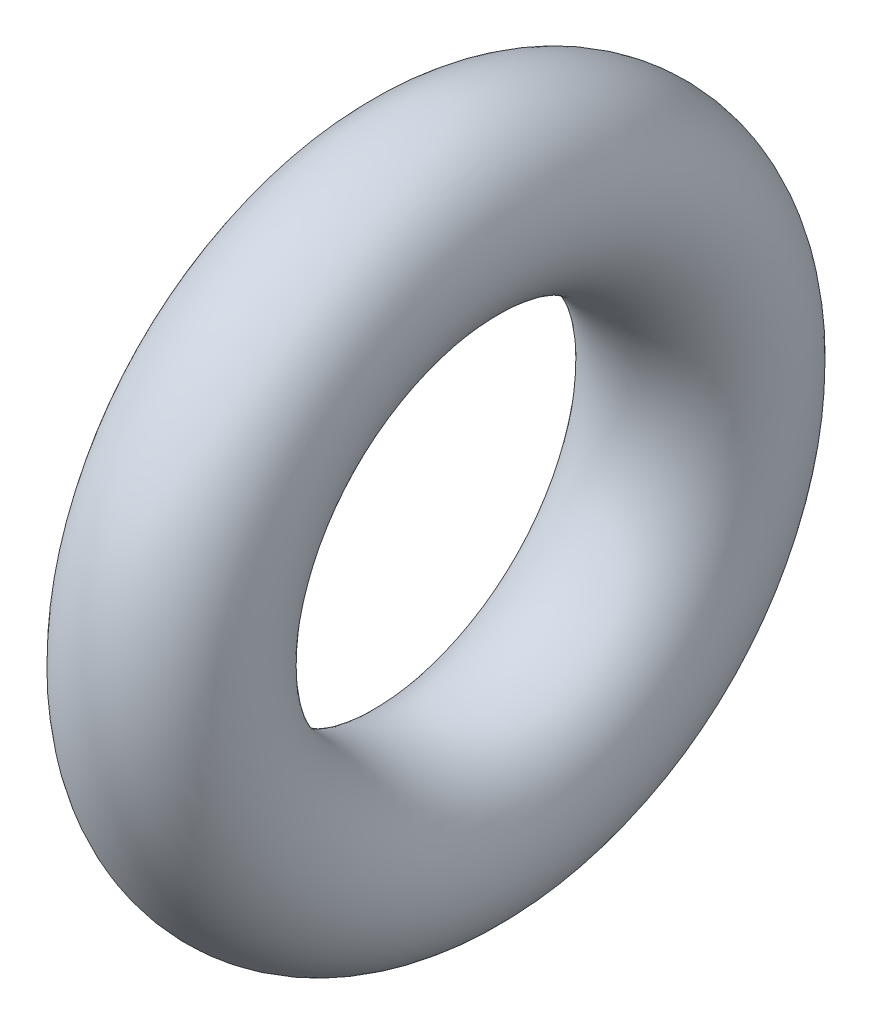
ISO-10303-21;
HEADER;
FILE_DESCRIPTION(('STEP AP214'),'2;1');
FILE_NAME('part.step','',(''),(''),'','','');
FILE_SCHEMA(('AUTOMOTIVE_DESIGN { 1 0 10303 214 1 1 1 1 }'));
ENDSEC;
DATA;
#1=APPLICATION_CONTEXT('core data for automotive mechanical design processes');
#2=APPLICATION_PROTOCOL_DEFINITION('international standard','automotive_design',2000,#1);
#3=PRODUCT_CONTEXT('',#1,'mechanical');
#4=PRODUCT('Part','Part','',(#3));
#5=PRODUCT_RELATED_PRODUCT_CATEGORY('part','',(#4));
#6=PRODUCT_DEFINITION_FORMATION('','',#4);
#7=PRODUCT_DEFINITION_CONTEXT('part definition',#1,'design');
#8=PRODUCT_DEFINITION('design','',#6,#7);
#9=PRODUCT_DEFINITION_SHAPE('','',#8);
#10=(LENGTH_UNIT() NAMED_UNIT(*) SI_UNIT(.MILLI.,.METRE.));
#11=(NAMED_UNIT(*) PLANE_ANGLE_UNIT() SI_UNIT($,.RADIAN.));
#12=(NAMED_UNIT(*) SI_UNIT($,.STERADIAN.) SOLID_ANGLE_UNIT());
#13=UNCERTAINTY_MEASURE_WITH_UNIT(LENGTH_MEASURE(1.E-05),#10,'distance_accuracy_value','');
#14=(GEOMETRIC_REPRESENTATION_CONTEXT(3) GLOBAL_UNCERTAINTY_ASSIGNED_CONTEXT((#13)) GLOBAL_UNIT_ASSIGNED_CONTEXT((#10,
#11,#12)) REPRESENTATION_CONTEXT('',''));
#15=CARTESIAN_POINT('',(0.,0.,0.));
#16=DIRECTION('',(0.,0.,1.));
#17=DIRECTION('',(1.,0.,0.));
#18=AXIS2_PLACEMENT_3D('',#15,#16,#17);
#19=CARTESIAN_POINT('',(15.6319248867625,0.,0.));
#20=DIRECTION('',(-1.,0.,0.));
#21=DIRECTION('',(0.,0.,1.));
#22=AXIS2_PLACEMENT_3D('',#19,#20,#21);
#23=TOROIDAL_SURFACE('',#22,7.5,2.5);
#24=CARTESIAN_POINT('',(15.6319248867625,0.,10.));
#25=VERTEX_POINT('',#24);
#26=VERTEX_LOOP('',#25);
#27=FACE_BOUND('',#26,.T.);
#28=ADVANCED_FACE('F31',(#27),#23,.T.);
#29=CLOSED_SHELL('',(#28));
#30=MANIFOLD_SOLID_BREP('B2',#29);
#31=ADVANCED_BREP_SHAPE_REPRESENTATION('',(#18,#30),#14);
#32=SHAPE_DEFINITION_REPRESENTATION(#9,#31);
ENDSEC;
END-ISO-10303-21;
